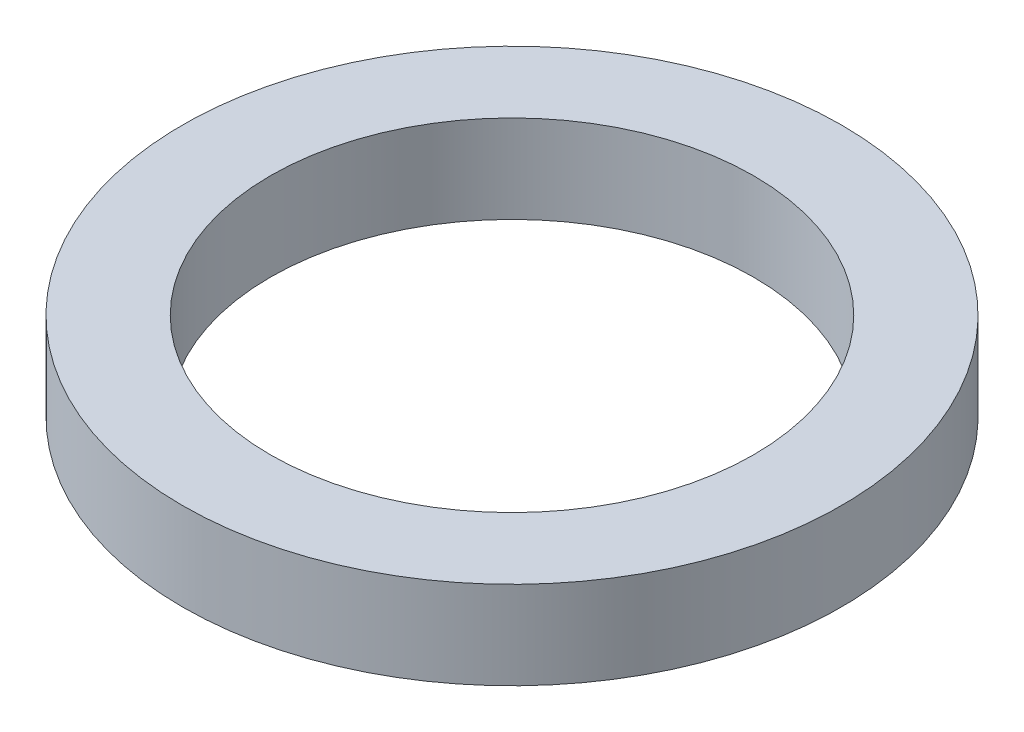
ISO-10303-21;
HEADER;
FILE_DESCRIPTION(('STEP AP214'),'2;1');
FILE_NAME('part.step','',(''),(''),'','','');
FILE_SCHEMA(('AUTOMOTIVE_DESIGN { 1 0 10303 214 1 1 1 1 }'));
ENDSEC;
DATA;
#1=APPLICATION_CONTEXT('core data for automotive mechanical design processes');
#2=APPLICATION_PROTOCOL_DEFINITION('international standard','automotive_design',2000,#1);
#3=PRODUCT_CONTEXT('',#1,'mechanical');
#4=PRODUCT('Part','Part','',(#3));
#5=PRODUCT_RELATED_PRODUCT_CATEGORY('part','',(#4));
#6=PRODUCT_DEFINITION_FORMATION('','',#4);
#7=PRODUCT_DEFINITION_CONTEXT('part definition',#1,'design');
#8=PRODUCT_DEFINITION('design','',#6,#7);
#9=PRODUCT_DEFINITION_SHAPE('','',#8);
#10=(LENGTH_UNIT() NAMED_UNIT(*) SI_UNIT(.MILLI.,.METRE.));
#11=(NAMED_UNIT(*) PLANE_ANGLE_UNIT() SI_UNIT($,.RADIAN.));
#12=(NAMED_UNIT(*) SI_UNIT($,.STERADIAN.) SOLID_ANGLE_UNIT());
#13=UNCERTAINTY_MEASURE_WITH_UNIT(LENGTH_MEASURE(1.E-05),#10,'distance_accuracy_value','');
#14=(GEOMETRIC_REPRESENTATION_CONTEXT(3) GLOBAL_UNCERTAINTY_ASSIGNED_CONTEXT((#13)) GLOBAL_UNIT_ASSIGNED_CONTEXT((#10,
#11,#12)) REPRESENTATION_CONTEXT('',''));
#15=CARTESIAN_POINT('',(0.,0.,0.));
#16=DIRECTION('',(0.,0.,1.));
#17=DIRECTION('',(1.,0.,0.));
#18=AXIS2_PLACEMENT_3D('',#15,#16,#17);
#19=CARTESIAN_POINT('',(0.,2.,0.));
#20=DIRECTION('',(0.,1.,0.));
#21=DIRECTION('',(0.,0.,1.));
#22=AXIS2_PLACEMENT_3D('',#19,#20,#21);
#23=PLANE('',#22);
#24=CARTESIAN_POINT('',(0.,2.,0.));
#25=DIRECTION('',(0.,1.,0.));
#26=DIRECTION('',(0.,0.,1.));
#27=AXIS2_PLACEMENT_3D('',#24,#25,#26);
#28=CIRCLE('',#27,7.5);
#29=CARTESIAN_POINT('',(0.,2.,7.5));
#30=VERTEX_POINT('',#29);
#31=EDGE_CURVE('E10',#30,#30,#28,.T.);
#32=ORIENTED_EDGE('',*,*,#31,.T.);
#33=EDGE_LOOP('',(#32));
#34=FACE_BOUND('',#33,.T.);
#35=CARTESIAN_POINT('',(0.,2.,0.));
#36=DIRECTION('',(0.,1.,0.));
#37=DIRECTION('',(0.,0.,1.));
#38=AXIS2_PLACEMENT_3D('',#35,#36,#37);
#39=CIRCLE('',#38,5.5);
#40=CARTESIAN_POINT('',(0.,2.,5.5));
#41=VERTEX_POINT('',#40);
#42=EDGE_CURVE('E44',#41,#41,#39,.T.);
#43=ORIENTED_EDGE('',*,*,#42,.F.);
#44=EDGE_LOOP('',(#43));
#45=FACE_BOUND('',#44,.T.);
#46=ADVANCED_FACE('F33',(#34,#45),#23,.T.);
#47=CARTESIAN_POINT('',(0.,0.,0.));
#48=DIRECTION('',(0.,1.,0.));
#49=DIRECTION('',(0.,0.,1.));
#50=AXIS2_PLACEMENT_3D('',#47,#48,#49);
#51=PLANE('',#50);
#52=CARTESIAN_POINT('',(0.,0.,0.));
#53=DIRECTION('',(0.,1.,0.));
#54=DIRECTION('',(0.,0.,1.));
#55=AXIS2_PLACEMENT_3D('',#52,#53,#54);
#56=CIRCLE('',#55,7.5);
#57=CARTESIAN_POINT('',(0.,0.,7.5));
#58=VERTEX_POINT('',#57);
#59=EDGE_CURVE('E37',#58,#58,#56,.T.);
#60=ORIENTED_EDGE('',*,*,#59,.F.);
#61=EDGE_LOOP('',(#60));
#62=FACE_BOUND('',#61,.T.);
#63=CARTESIAN_POINT('',(0.,0.,0.));
#64=DIRECTION('',(0.,1.,0.));
#65=DIRECTION('',(0.,0.,1.));
#66=AXIS2_PLACEMENT_3D('',#63,#64,#65);
#67=CIRCLE('',#66,5.5);
#68=CARTESIAN_POINT('',(0.,0.,5.5));
#69=VERTEX_POINT('',#68);
#70=EDGE_CURVE('E46',#69,#69,#67,.T.);
#71=ORIENTED_EDGE('',*,*,#70,.T.);
#72=EDGE_LOOP('',(#71));
#73=FACE_BOUND('',#72,.T.);
#74=ADVANCED_FACE('F56',(#62,#73),#51,.F.);
#75=CARTESIAN_POINT('',(0.,2.,0.));
#76=DIRECTION('',(0.,-1.,0.));
#77=DIRECTION('',(0.,0.,-1.));
#78=AXIS2_PLACEMENT_3D('',#75,#76,#77);
#79=CYLINDRICAL_SURFACE('',#78,7.5);
#80=ORIENTED_EDGE('',*,*,#31,.F.);
#81=EDGE_LOOP('',(#80));
#82=FACE_BOUND('',#81,.T.);
#83=ORIENTED_EDGE('',*,*,#59,.T.);
#84=EDGE_LOOP('',(#83));
#85=FACE_BOUND('',#84,.T.);
#86=ADVANCED_FACE('F35',(#82,#85),#79,.T.);
#87=CARTESIAN_POINT('',(0.,2.,0.));
#88=DIRECTION('',(0.,-1.,0.));
#89=DIRECTION('',(0.,0.,-1.));
#90=AXIS2_PLACEMENT_3D('',#87,#88,#89);
#91=CYLINDRICAL_SURFACE('',#90,5.5);
#92=ORIENTED_EDGE('',*,*,#42,.T.);
#93=EDGE_LOOP('',(#92));
#94=FACE_BOUND('',#93,.T.);
#95=ORIENTED_EDGE('',*,*,#70,.F.);
#96=EDGE_LOOP('',(#95));
#97=FACE_BOUND('',#96,.T.);
#98=ADVANCED_FACE('F52',(#94,#97),#91,.F.);
#99=CLOSED_SHELL('',(#46,#74,#86,#98));
#100=MANIFOLD_SOLID_BREP('B2',#99);
#101=ADVANCED_BREP_SHAPE_REPRESENTATION('',(#18,#100),#14);
#102=SHAPE_DEFINITION_REPRESENTATION(#9,#101);
ENDSEC;
END-ISO-10303-21;
